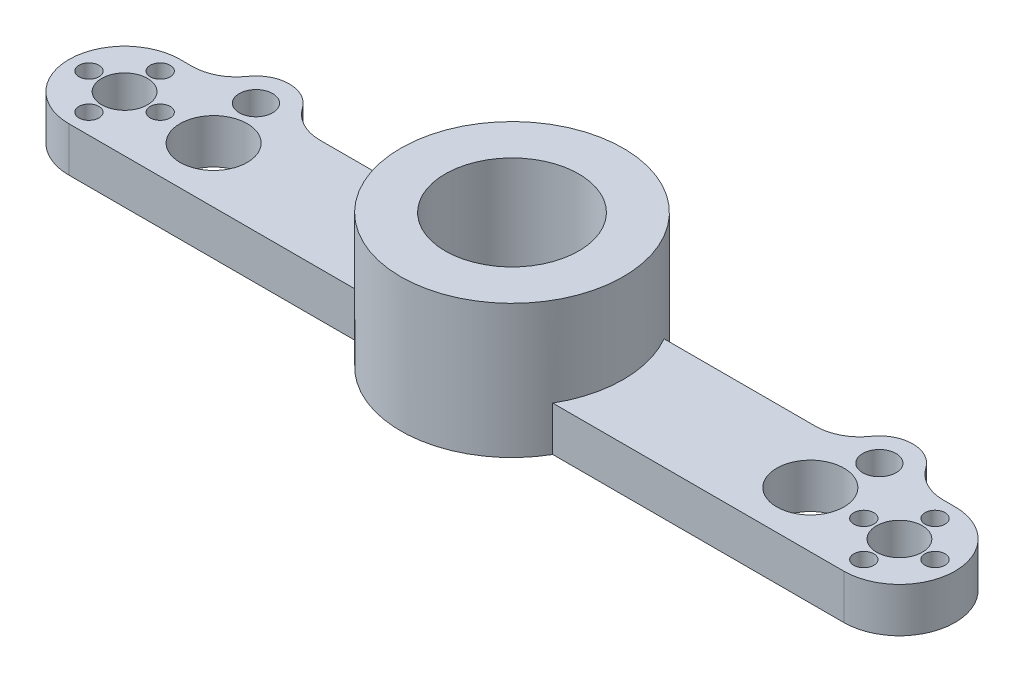
ISO-10303-21;
HEADER;
FILE_DESCRIPTION(('STEP AP214'),'2;1');
FILE_NAME('part.step','',(''),(''),'','','');
FILE_SCHEMA(('AUTOMOTIVE_DESIGN { 1 0 10303 214 1 1 1 1 }'));
ENDSEC;
DATA;
#1=APPLICATION_CONTEXT('core data for automotive mechanical design processes');
#2=APPLICATION_PROTOCOL_DEFINITION('international standard','automotive_design',2000,#1);
#3=PRODUCT_CONTEXT('',#1,'mechanical');
#4=PRODUCT('Part','Part','',(#3));
#5=PRODUCT_RELATED_PRODUCT_CATEGORY('part','',(#4));
#6=PRODUCT_DEFINITION_FORMATION('','',#4);
#7=PRODUCT_DEFINITION_CONTEXT('part definition',#1,'design');
#8=PRODUCT_DEFINITION('design','',#6,#7);
#9=PRODUCT_DEFINITION_SHAPE('','',#8);
#10=(LENGTH_UNIT() NAMED_UNIT(*) SI_UNIT(.MILLI.,.METRE.));
#11=(NAMED_UNIT(*) PLANE_ANGLE_UNIT() SI_UNIT($,.RADIAN.));
#12=(NAMED_UNIT(*) SI_UNIT($,.STERADIAN.) SOLID_ANGLE_UNIT());
#13=UNCERTAINTY_MEASURE_WITH_UNIT(LENGTH_MEASURE(1.E-05),#10,'distance_accuracy_value','');
#14=(GEOMETRIC_REPRESENTATION_CONTEXT(3) GLOBAL_UNCERTAINTY_ASSIGNED_CONTEXT((#13)) GLOBAL_UNIT_ASSIGNED_CONTEXT((#10,
#11,#12)) REPRESENTATION_CONTEXT('',''));
#15=CARTESIAN_POINT('',(0.,0.,0.));
#16=DIRECTION('',(0.,0.,1.));
#17=DIRECTION('',(1.,0.,0.));
#18=AXIS2_PLACEMENT_3D('',#15,#16,#17);
#19=CARTESIAN_POINT('',(-87.,10.,-12.5));
#20=DIRECTION('',(0.,0.,1.));
#21=DIRECTION('',(1.,0.,0.));
#22=AXIS2_PLACEMENT_3D('',#19,#20,#21);
#23=PLANE('',#22);
#24=DIRECTION('',(-1.,0.,0.));
#25=VECTOR('',#24,1.);
#26=CARTESIAN_POINT('',(-87.,0.,-12.5));
#27=LINE('',#26,#25);
#28=CARTESIAN_POINT('',(-21.650635094611,0.,-12.5));
#29=VERTEX_POINT('',#28);
#30=CARTESIAN_POINT('',(-55.6385933836576,0.,-12.5));
#31=VERTEX_POINT('',#30);
#32=EDGE_CURVE('E281',#29,#31,#27,.T.);
#33=ORIENTED_EDGE('',*,*,#32,.T.);
#34=DIRECTION('',(0.,1.,0.));
#35=VECTOR('',#34,1.);
#36=CARTESIAN_POINT('',(-55.6385933836576,10.,-12.5));
#37=LINE('',#36,#35);
#38=CARTESIAN_POINT('',(-55.6385933836576,10.,-12.5));
#39=VERTEX_POINT('',#38);
#40=EDGE_CURVE('E204',#31,#39,#37,.T.);
#41=ORIENTED_EDGE('',*,*,#40,.T.);
#42=DIRECTION('',(-1.,0.,0.));
#43=VECTOR('',#42,1.);
#44=CARTESIAN_POINT('',(-87.,10.,-12.5));
#45=LINE('',#44,#43);
#46=CARTESIAN_POINT('',(-21.650635094611,10.,-12.5));
#47=VERTEX_POINT('',#46);
#48=EDGE_CURVE('E259',#47,#39,#45,.T.);
#49=ORIENTED_EDGE('',*,*,#48,.F.);
#50=DIRECTION('',(0.,-1.,0.));
#51=VECTOR('',#50,1.);
#52=CARTESIAN_POINT('',(-21.650635094611,10.,-12.5));
#53=LINE('',#52,#51);
#54=EDGE_CURVE('E183',#47,#29,#53,.T.);
#55=ORIENTED_EDGE('',*,*,#54,.T.);
#56=EDGE_LOOP('',(#33,#41,#49,#55));
#57=FACE_BOUND('',#56,.T.);
#58=ADVANCED_FACE('F32',(#57),#23,.F.);
#59=CARTESIAN_POINT('',(21.650635094611,10.,-12.5));
#60=DIRECTION('',(0.,0.,1.));
#61=DIRECTION('',(1.,0.,0.));
#62=AXIS2_PLACEMENT_3D('',#59,#60,#61);
#63=PLANE('',#62);
#64=DIRECTION('',(-1.,0.,0.));
#65=VECTOR('',#64,1.);
#66=CARTESIAN_POINT('',(21.650635094611,0.,-12.5));
#67=LINE('',#66,#65);
#68=CARTESIAN_POINT('',(87.,0.,-12.5));
#69=VERTEX_POINT('',#68);
#70=CARTESIAN_POINT('',(84.3614066163478,0.,-12.5));
#71=VERTEX_POINT('',#70);
#72=EDGE_CURVE('E260',#69,#71,#67,.T.);
#73=ORIENTED_EDGE('',*,*,#72,.T.);
#74=DIRECTION('',(0.,1.,0.));
#75=VECTOR('',#74,1.);
#76=CARTESIAN_POINT('',(84.3614066163478,10.,-12.5));
#77=LINE('',#76,#75);
#78=CARTESIAN_POINT('',(84.3614066163478,10.,-12.5));
#79=VERTEX_POINT('',#78);
#80=EDGE_CURVE('E182',#71,#79,#77,.T.);
#81=ORIENTED_EDGE('',*,*,#80,.T.);
#82=DIRECTION('',(-1.,0.,0.));
#83=VECTOR('',#82,1.);
#84=CARTESIAN_POINT('',(21.650635094611,10.,-12.5));
#85=LINE('',#84,#83);
#86=CARTESIAN_POINT('',(87.,10.,-12.5));
#87=VERTEX_POINT('',#86);
#88=EDGE_CURVE('E274',#87,#79,#85,.T.);
#89=ORIENTED_EDGE('',*,*,#88,.F.);
#90=DIRECTION('',(0.,-1.,0.));
#91=VECTOR('',#90,1.);
#92=CARTESIAN_POINT('',(87.,10.,-12.5));
#93=LINE('',#92,#91);
#94=EDGE_CURVE('E293',#87,#69,#93,.T.);
#95=ORIENTED_EDGE('',*,*,#94,.T.);
#96=EDGE_LOOP('',(#73,#81,#89,#95));
#97=FACE_BOUND('',#96,.T.);
#98=ADVANCED_FACE('F313',(#97),#63,.F.);
#99=CARTESIAN_POINT('',(0.,10.,0.));
#100=DIRECTION('',(0.,1.,0.));
#101=DIRECTION('',(0.,0.,1.));
#102=AXIS2_PLACEMENT_3D('',#99,#100,#101);
#103=PLANE('',#102);
#104=CARTESIAN_POINT('',(70.0000000000027,10.,-12.5));
#105=DIRECTION('',(0.,1.,0.));
#106=DIRECTION('',(0.,0.,1.));
#107=AXIS2_PLACEMENT_3D('',#104,#105,#106);
#108=CIRCLE('',#107,3.75);
#109=CARTESIAN_POINT('',(70.0000000000027,10.,-8.75));
#110=VERTEX_POINT('',#109);
#111=EDGE_CURVE('E350',#110,#110,#108,.T.);
#112=ORIENTED_EDGE('',*,*,#111,.F.);
#113=EDGE_LOOP('',(#112));
#114=FACE_BOUND('',#113,.T.);
#115=CARTESIAN_POINT('',(0.,10.,0.));
#116=DIRECTION('',(0.,1.,0.));
#117=DIRECTION('',(0.,0.,1.));
#118=AXIS2_PLACEMENT_3D('',#115,#116,#117);
#119=CIRCLE('',#118,25.);
#120=CARTESIAN_POINT('',(21.650635094611,10.,12.5));
#121=VERTEX_POINT('',#120);
#122=CARTESIAN_POINT('',(21.650635094611,10.,-12.5));
#123=VERTEX_POINT('',#122);
#124=EDGE_CURVE('E160',#121,#123,#119,.T.);
#125=ORIENTED_EDGE('',*,*,#124,.F.);
#126=DIRECTION('',(1.,0.,0.));
#127=VECTOR('',#126,1.);
#128=CARTESIAN_POINT('',(87.,10.,12.5));
#129=LINE('',#128,#127);
#130=CARTESIAN_POINT('',(87.,10.,12.5));
#131=VERTEX_POINT('',#130);
#132=EDGE_CURVE('E143',#121,#131,#129,.T.);
#133=ORIENTED_EDGE('',*,*,#132,.T.);
#134=CARTESIAN_POINT('',(87.,10.,0.));
#135=DIRECTION('',(0.,1.,0.));
#136=DIRECTION('',(0.,0.,1.));
#137=AXIS2_PLACEMENT_3D('',#134,#135,#136);
#138=CIRCLE('',#137,12.5);
#139=EDGE_CURVE('E152',#131,#87,#138,.T.);
#140=ORIENTED_EDGE('',*,*,#139,.T.);
#141=ORIENTED_EDGE('',*,*,#88,.T.);
#142=CARTESIAN_POINT('',(84.3614066163478,10.,-22.5));
#143=DIRECTION('',(0.,1.,0.));
#144=DIRECTION('',(0.,0.,1.));
#145=AXIS2_PLACEMENT_3D('',#142,#143,#144);
#146=CIRCLE('',#145,10.);
#147=CARTESIAN_POINT('',(76.1548885498649,10.,-16.7857142857143));
#148=VERTEX_POINT('',#147);
#149=EDGE_CURVE('E215',#79,#148,#146,.F.);
#150=ORIENTED_EDGE('',*,*,#149,.T.);
#151=CARTESIAN_POINT('',(70.0000000000027,10.,-12.5));
#152=DIRECTION('',(0.,1.,0.));
#153=DIRECTION('',(0.,0.,1.));
#154=AXIS2_PLACEMENT_3D('',#151,#152,#153);
#155=CIRCLE('',#154,7.50000000000001);
#156=CARTESIAN_POINT('',(63.8451114501405,10.,-16.7857142857143));
#157=VERTEX_POINT('',#156);
#158=EDGE_CURVE('E246',#148,#157,#155,.T.);
#159=ORIENTED_EDGE('',*,*,#158,.T.);
#160=CARTESIAN_POINT('',(55.6385933836576,10.,-22.5));
#161=DIRECTION('',(0.,1.,0.));
#162=DIRECTION('',(0.,0.,1.));
#163=AXIS2_PLACEMENT_3D('',#160,#161,#162);
#164=CIRCLE('',#163,10.);
#165=CARTESIAN_POINT('',(55.6385933836576,10.,-12.5));
#166=VERTEX_POINT('',#165);
#167=EDGE_CURVE('E40',#157,#166,#164,.F.);
#168=ORIENTED_EDGE('',*,*,#167,.T.);
#169=EDGE_CURVE('E168',#166,#123,#85,.T.);
#170=ORIENTED_EDGE('',*,*,#169,.T.);
#171=EDGE_LOOP('',(#125,#133,#140,#141,#150,#159,#168,#170));
#172=FACE_BOUND('',#171,.T.);
#173=CARTESIAN_POINT('',(87.,10.,0.));
#174=DIRECTION('',(0.,1.,0.));
#175=DIRECTION('',(0.,0.,1.));
#176=AXIS2_PLACEMENT_3D('',#173,#174,#175);
#177=CIRCLE('',#176,5.15);
#178=CARTESIAN_POINT('',(87.,10.,5.15));
#179=VERTEX_POINT('',#178);
#180=EDGE_CURVE('E786',#179,#179,#177,.T.);
#181=ORIENTED_EDGE('',*,*,#180,.F.);
#182=EDGE_LOOP('',(#181));
#183=FACE_BOUND('',#182,.T.);
#184=CARTESIAN_POINT('',(87.,10.,-8.));
#185=DIRECTION('',(0.,1.,0.));
#186=DIRECTION('',(0.,0.,1.));
#187=AXIS2_PLACEMENT_3D('',#184,#185,#186);
#188=CIRCLE('',#187,2.25);
#189=CARTESIAN_POINT('',(87.,10.,-5.75));
#190=VERTEX_POINT('',#189);
#191=EDGE_CURVE('E809',#190,#190,#188,.T.);
#192=ORIENTED_EDGE('',*,*,#191,.F.);
#193=EDGE_LOOP('',(#192));
#194=FACE_BOUND('',#193,.T.);
#195=CARTESIAN_POINT('',(95.,10.,0.));
#196=DIRECTION('',(0.,1.,0.));
#197=DIRECTION('',(0.,0.,1.));
#198=AXIS2_PLACEMENT_3D('',#195,#196,#197);
#199=CIRCLE('',#198,2.25);
#200=CARTESIAN_POINT('',(95.,10.,2.25000000000003));
#201=VERTEX_POINT('',#200);
#202=EDGE_CURVE('E813',#201,#201,#199,.T.);
#203=ORIENTED_EDGE('',*,*,#202,.F.);
#204=EDGE_LOOP('',(#203));
#205=FACE_BOUND('',#204,.T.);
#206=CARTESIAN_POINT('',(87.,10.,8.));
#207=DIRECTION('',(0.,1.,0.));
#208=DIRECTION('',(0.,0.,1.));
#209=AXIS2_PLACEMENT_3D('',#206,#207,#208);
#210=CIRCLE('',#209,2.25);
#211=CARTESIAN_POINT('',(87.,10.,10.25));
#212=VERTEX_POINT('',#211);
#213=EDGE_CURVE('E817',#212,#212,#210,.T.);
#214=ORIENTED_EDGE('',*,*,#213,.F.);
#215=EDGE_LOOP('',(#214));
#216=FACE_BOUND('',#215,.T.);
#217=CARTESIAN_POINT('',(79.,10.,0.));
#218=DIRECTION('',(0.,1.,0.));
#219=DIRECTION('',(0.,0.,1.));
#220=AXIS2_PLACEMENT_3D('',#217,#218,#219);
#221=CIRCLE('',#220,2.25);
#222=CARTESIAN_POINT('',(79.,10.,2.24999999999992));
#223=VERTEX_POINT('',#222);
#224=EDGE_CURVE('E821',#223,#223,#221,.T.);
#225=ORIENTED_EDGE('',*,*,#224,.F.);
#226=EDGE_LOOP('',(#225));
#227=FACE_BOUND('',#226,.T.);
#228=CARTESIAN_POINT('',(67.,10.,0.));
#229=DIRECTION('',(0.,-1.,0.));
#230=DIRECTION('',(0.,0.,1.));
#231=AXIS2_PLACEMENT_3D('',#228,#229,#230);
#232=CIRCLE('',#231,7.55);
#233=CARTESIAN_POINT('',(67.,10.,7.55));
#234=VERTEX_POINT('',#233);
#235=EDGE_CURVE('E175',#234,#234,#232,.T.);
#236=ORIENTED_EDGE('',*,*,#235,.T.);
#237=EDGE_LOOP('',(#236));
#238=FACE_BOUND('',#237,.T.);
#239=ADVANCED_FACE('F166',(#114,#172,#183,#194,#205,#216,#227,#238),#103,.T.);
#240=CARTESIAN_POINT('',(-70.0000000000027,10.,-12.5));
#241=DIRECTION('',(0.,1.,0.));
#242=DIRECTION('',(0.,0.,1.));
#243=AXIS2_PLACEMENT_3D('',#240,#241,#242);
#244=CIRCLE('',#243,3.75);
#245=CARTESIAN_POINT('',(-70.0000000000027,10.,-8.74999999999999));
#246=VERTEX_POINT('',#245);
#247=EDGE_CURVE('E338',#246,#246,#244,.T.);
#248=ORIENTED_EDGE('',*,*,#247,.F.);
#249=EDGE_LOOP('',(#248));
#250=FACE_BOUND('',#249,.T.);
#251=CARTESIAN_POINT('',(-21.650635094611,10.,12.5));
#252=VERTEX_POINT('',#251);
#253=EDGE_CURVE('E173',#47,#252,#119,.T.);
#254=ORIENTED_EDGE('',*,*,#253,.F.);
#255=ORIENTED_EDGE('',*,*,#48,.T.);
#256=CARTESIAN_POINT('',(-55.6385933836576,10.,-22.5));
#257=DIRECTION('',(0.,1.,0.));
#258=DIRECTION('',(0.,0.,1.));
#259=AXIS2_PLACEMENT_3D('',#256,#257,#258);
#260=CIRCLE('',#259,10.);
#261=CARTESIAN_POINT('',(-63.8451114501405,10.,-16.7857142857143));
#262=VERTEX_POINT('',#261);
#263=EDGE_CURVE('E219',#39,#262,#260,.F.);
#264=ORIENTED_EDGE('',*,*,#263,.T.);
#265=CARTESIAN_POINT('',(-70.0000000000027,10.,-12.5));
#266=DIRECTION('',(0.,1.,0.));
#267=DIRECTION('',(0.,0.,-1.));
#268=AXIS2_PLACEMENT_3D('',#265,#266,#267);
#269=CIRCLE('',#268,7.50000000000001);
#270=CARTESIAN_POINT('',(-76.1548885498649,10.,-16.7857142857143));
#271=VERTEX_POINT('',#270);
#272=EDGE_CURVE('E247',#262,#271,#269,.T.);
#273=ORIENTED_EDGE('',*,*,#272,.T.);
#274=CARTESIAN_POINT('',(-84.3614066163478,10.,-22.5));
#275=DIRECTION('',(0.,1.,0.));
#276=DIRECTION('',(0.,0.,1.));
#277=AXIS2_PLACEMENT_3D('',#274,#275,#276);
#278=CIRCLE('',#277,10.);
#279=CARTESIAN_POINT('',(-84.3614066163478,10.,-12.5));
#280=VERTEX_POINT('',#279);
#281=EDGE_CURVE('E223',#271,#280,#278,.F.);
#282=ORIENTED_EDGE('',*,*,#281,.T.);
#283=CARTESIAN_POINT('',(-87.,10.,-12.5));
#284=VERTEX_POINT('',#283);
#285=EDGE_CURVE('E254',#280,#284,#45,.T.);
#286=ORIENTED_EDGE('',*,*,#285,.T.);
#287=CARTESIAN_POINT('',(-87.,10.,0.));
#288=DIRECTION('',(0.,1.,0.));
#289=DIRECTION('',(0.,0.,1.));
#290=AXIS2_PLACEMENT_3D('',#287,#288,#289);
#291=CIRCLE('',#290,12.5);
#292=CARTESIAN_POINT('',(-87.,10.,12.5));
#293=VERTEX_POINT('',#292);
#294=EDGE_CURVE('E263',#284,#293,#291,.T.);
#295=ORIENTED_EDGE('',*,*,#294,.T.);
#296=DIRECTION('',(1.,0.,0.));
#297=VECTOR('',#296,1.);
#298=CARTESIAN_POINT('',(-21.650635094611,10.,12.5));
#299=LINE('',#298,#297);
#300=EDGE_CURVE('E153',#293,#252,#299,.T.);
#301=ORIENTED_EDGE('',*,*,#300,.T.);
#302=EDGE_LOOP('',(#254,#255,#264,#273,#282,#286,#295,#301));
#303=FACE_BOUND('',#302,.T.);
#304=CARTESIAN_POINT('',(-67.,10.,0.));
#305=DIRECTION('',(0.,1.,0.));
#306=DIRECTION('',(0.,0.,1.));
#307=AXIS2_PLACEMENT_3D('',#304,#305,#306);
#308=CIRCLE('',#307,7.55);
#309=CARTESIAN_POINT('',(-67.,10.,7.55));
#310=VERTEX_POINT('',#309);
#311=EDGE_CURVE('E835',#310,#310,#308,.T.);
#312=ORIENTED_EDGE('',*,*,#311,.F.);
#313=EDGE_LOOP('',(#312));
#314=FACE_BOUND('',#313,.T.);
#315=CARTESIAN_POINT('',(-79.,10.,0.));
#316=DIRECTION('',(0.,1.,0.));
#317=DIRECTION('',(0.,0.,1.));
#318=AXIS2_PLACEMENT_3D('',#315,#316,#317);
#319=CIRCLE('',#318,2.25);
#320=CARTESIAN_POINT('',(-79.,10.,2.24999999999992));
#321=VERTEX_POINT('',#320);
#322=EDGE_CURVE('E837',#321,#321,#319,.T.);
#323=ORIENTED_EDGE('',*,*,#322,.F.);
#324=EDGE_LOOP('',(#323));
#325=FACE_BOUND('',#324,.T.);
#326=CARTESIAN_POINT('',(-87.,10.,8.));
#327=DIRECTION('',(0.,1.,0.));
#328=DIRECTION('',(0.,0.,1.));
#329=AXIS2_PLACEMENT_3D('',#326,#327,#328);
#330=CIRCLE('',#329,2.25);
#331=CARTESIAN_POINT('',(-87.,10.,10.25));
#332=VERTEX_POINT('',#331);
#333=EDGE_CURVE('E843',#332,#332,#330,.T.);
#334=ORIENTED_EDGE('',*,*,#333,.F.);
#335=EDGE_LOOP('',(#334));
#336=FACE_BOUND('',#335,.T.);
#337=CARTESIAN_POINT('',(-95.,10.,0.));
#338=DIRECTION('',(0.,1.,0.));
#339=DIRECTION('',(0.,0.,1.));
#340=AXIS2_PLACEMENT_3D('',#337,#338,#339);
#341=CIRCLE('',#340,2.25);
#342=CARTESIAN_POINT('',(-95.,10.,2.25000000000003));
#343=VERTEX_POINT('',#342);
#344=EDGE_CURVE('E847',#343,#343,#341,.T.);
#345=ORIENTED_EDGE('',*,*,#344,.F.);
#346=EDGE_LOOP('',(#345));
#347=FACE_BOUND('',#346,.T.);
#348=CARTESIAN_POINT('',(-87.,10.,-8.));
#349=DIRECTION('',(0.,1.,0.));
#350=DIRECTION('',(0.,0.,1.));
#351=AXIS2_PLACEMENT_3D('',#348,#349,#350);
#352=CIRCLE('',#351,2.25);
#353=CARTESIAN_POINT('',(-87.,10.,-5.75));
#354=VERTEX_POINT('',#353);
#355=EDGE_CURVE('E777',#354,#354,#352,.T.);
#356=ORIENTED_EDGE('',*,*,#355,.F.);
#357=EDGE_LOOP('',(#356));
#358=FACE_BOUND('',#357,.T.);
#359=CARTESIAN_POINT('',(-87.,10.,0.));
#360=DIRECTION('',(0.,1.,0.));
#361=DIRECTION('',(0.,0.,1.));
#362=AXIS2_PLACEMENT_3D('',#359,#360,#361);
#363=CIRCLE('',#362,5.15);
#364=CARTESIAN_POINT('',(-87.,10.,5.15));
#365=VERTEX_POINT('',#364);
#366=EDGE_CURVE('E280',#365,#365,#363,.T.);
#367=ORIENTED_EDGE('',*,*,#366,.F.);
#368=EDGE_LOOP('',(#367));
#369=FACE_BOUND('',#368,.T.);
#370=ADVANCED_FACE('F252',(#250,#303,#314,#325,#336,#347,#358,#369),#103,.T.);
#371=CARTESIAN_POINT('',(0.,0.,0.));
#372=DIRECTION('',(0.,1.,0.));
#373=DIRECTION('',(0.,0.,1.));
#374=AXIS2_PLACEMENT_3D('',#371,#372,#373);
#375=PLANE('',#374);
#376=CARTESIAN_POINT('',(70.0000000000027,0.,-12.5));
#377=DIRECTION('',(0.,1.,0.));
#378=DIRECTION('',(0.,0.,1.));
#379=AXIS2_PLACEMENT_3D('',#376,#377,#378);
#380=CIRCLE('',#379,1.69999999999999);
#381=CARTESIAN_POINT('',(70.0000000000027,0.,-10.8));
#382=VERTEX_POINT('',#381);
#383=EDGE_CURVE('E341',#382,#382,#380,.T.);
#384=ORIENTED_EDGE('',*,*,#383,.T.);
#385=EDGE_LOOP('',(#384));
#386=FACE_BOUND('',#385,.T.);
#387=CARTESIAN_POINT('',(-70.0000000000027,0.,-12.5));
#388=DIRECTION('',(0.,1.,0.));
#389=DIRECTION('',(0.,0.,1.));
#390=AXIS2_PLACEMENT_3D('',#387,#388,#389);
#391=CIRCLE('',#390,1.69999999999999);
#392=CARTESIAN_POINT('',(-70.0000000000027,0.,-10.8));
#393=VERTEX_POINT('',#392);
#394=EDGE_CURVE('E328',#393,#393,#391,.T.);
#395=ORIENTED_EDGE('',*,*,#394,.T.);
#396=EDGE_LOOP('',(#395));
#397=FACE_BOUND('',#396,.T.);
#398=CARTESIAN_POINT('',(67.,0.,0.));
#399=DIRECTION('',(0.,-1.,0.));
#400=DIRECTION('',(0.,0.,1.));
#401=AXIS2_PLACEMENT_3D('',#398,#399,#400);
#402=CIRCLE('',#401,7.55);
#403=CARTESIAN_POINT('',(67.,0.,7.55));
#404=VERTEX_POINT('',#403);
#405=EDGE_CURVE('E740',#404,#404,#402,.T.);
#406=ORIENTED_EDGE('',*,*,#405,.F.);
#407=EDGE_LOOP('',(#406));
#408=FACE_BOUND('',#407,.T.);
#409=CARTESIAN_POINT('',(79.,0.,0.));
#410=DIRECTION('',(0.,1.,0.));
#411=DIRECTION('',(0.,0.,1.));
#412=AXIS2_PLACEMENT_3D('',#409,#410,#411);
#413=CIRCLE('',#412,2.25);
#414=CARTESIAN_POINT('',(79.,0.,2.24999999999992));
#415=VERTEX_POINT('',#414);
#416=EDGE_CURVE('E744',#415,#415,#413,.T.);
#417=ORIENTED_EDGE('',*,*,#416,.T.);
#418=EDGE_LOOP('',(#417));
#419=FACE_BOUND('',#418,.T.);
#420=CARTESIAN_POINT('',(87.,0.,8.));
#421=DIRECTION('',(0.,1.,0.));
#422=DIRECTION('',(0.,0.,1.));
#423=AXIS2_PLACEMENT_3D('',#420,#421,#422);
#424=CIRCLE('',#423,2.25);
#425=CARTESIAN_POINT('',(87.,0.,10.25));
#426=VERTEX_POINT('',#425);
#427=EDGE_CURVE('E748',#426,#426,#424,.T.);
#428=ORIENTED_EDGE('',*,*,#427,.T.);
#429=EDGE_LOOP('',(#428));
#430=FACE_BOUND('',#429,.T.);
#431=CARTESIAN_POINT('',(95.,0.,0.));
#432=DIRECTION('',(0.,1.,0.));
#433=DIRECTION('',(0.,0.,1.));
#434=AXIS2_PLACEMENT_3D('',#431,#432,#433);
#435=CIRCLE('',#434,2.25);
#436=CARTESIAN_POINT('',(95.,0.,2.25000000000003));
#437=VERTEX_POINT('',#436);
#438=EDGE_CURVE('E752',#437,#437,#435,.T.);
#439=ORIENTED_EDGE('',*,*,#438,.T.);
#440=EDGE_LOOP('',(#439));
#441=FACE_BOUND('',#440,.T.);
#442=CARTESIAN_POINT('',(87.,0.,-8.));
#443=DIRECTION('',(0.,1.,0.));
#444=DIRECTION('',(0.,0.,1.));
#445=AXIS2_PLACEMENT_3D('',#442,#443,#444);
#446=CIRCLE('',#445,2.25);
#447=CARTESIAN_POINT('',(87.,0.,-5.75));
#448=VERTEX_POINT('',#447);
#449=EDGE_CURVE('E756',#448,#448,#446,.T.);
#450=ORIENTED_EDGE('',*,*,#449,.T.);
#451=EDGE_LOOP('',(#450));
#452=FACE_BOUND('',#451,.T.);
#453=CARTESIAN_POINT('',(-67.,0.,0.));
#454=DIRECTION('',(0.,1.,0.));
#455=DIRECTION('',(0.,0.,1.));
#456=AXIS2_PLACEMENT_3D('',#453,#454,#455);
#457=CIRCLE('',#456,7.55);
#458=CARTESIAN_POINT('',(-67.,0.,7.55));
#459=VERTEX_POINT('',#458);
#460=EDGE_CURVE('E760',#459,#459,#457,.T.);
#461=ORIENTED_EDGE('',*,*,#460,.T.);
#462=EDGE_LOOP('',(#461));
#463=FACE_BOUND('',#462,.T.);
#464=CARTESIAN_POINT('',(-79.,0.,0.));
#465=DIRECTION('',(0.,1.,0.));
#466=DIRECTION('',(0.,0.,1.));
#467=AXIS2_PLACEMENT_3D('',#464,#465,#466);
#468=CIRCLE('',#467,2.25);
#469=CARTESIAN_POINT('',(-79.,0.,2.24999999999992));
#470=VERTEX_POINT('',#469);
#471=EDGE_CURVE('E764',#470,#470,#468,.T.);
#472=ORIENTED_EDGE('',*,*,#471,.T.);
#473=EDGE_LOOP('',(#472));
#474=FACE_BOUND('',#473,.T.);
#475=CARTESIAN_POINT('',(-87.,0.,8.));
#476=DIRECTION('',(0.,1.,0.));
#477=DIRECTION('',(0.,0.,1.));
#478=AXIS2_PLACEMENT_3D('',#475,#476,#477);
#479=CIRCLE('',#478,2.25);
#480=CARTESIAN_POINT('',(-87.,0.,10.25));
#481=VERTEX_POINT('',#480);
#482=EDGE_CURVE('E768',#481,#481,#479,.T.);
#483=ORIENTED_EDGE('',*,*,#482,.T.);
#484=EDGE_LOOP('',(#483));
#485=FACE_BOUND('',#484,.T.);
#486=CARTESIAN_POINT('',(-95.,0.,0.));
#487=DIRECTION('',(0.,1.,0.));
#488=DIRECTION('',(0.,0.,1.));
#489=AXIS2_PLACEMENT_3D('',#486,#487,#488);
#490=CIRCLE('',#489,2.25);
#491=CARTESIAN_POINT('',(-95.,0.,2.25000000000003));
#492=VERTEX_POINT('',#491);
#493=EDGE_CURVE('E772',#492,#492,#490,.T.);
#494=ORIENTED_EDGE('',*,*,#493,.T.);
#495=EDGE_LOOP('',(#494));
#496=FACE_BOUND('',#495,.T.);
#497=CARTESIAN_POINT('',(-87.,0.,-8.));
#498=DIRECTION('',(0.,1.,0.));
#499=DIRECTION('',(0.,0.,1.));
#500=AXIS2_PLACEMENT_3D('',#497,#498,#499);
#501=CIRCLE('',#500,2.25);
#502=CARTESIAN_POINT('',(-87.,0.,-5.75));
#503=VERTEX_POINT('',#502);
#504=EDGE_CURVE('E775',#503,#503,#501,.T.);
#505=ORIENTED_EDGE('',*,*,#504,.T.);
#506=EDGE_LOOP('',(#505));
#507=FACE_BOUND('',#506,.T.);
#508=CARTESIAN_POINT('',(0.,0.,0.));
#509=DIRECTION('',(0.,1.,0.));
#510=DIRECTION('',(0.,0.,1.));
#511=AXIS2_PLACEMENT_3D('',#508,#509,#510);
#512=CIRCLE('',#511,25.);
#513=CARTESIAN_POINT('',(21.650635094611,0.,-12.5));
#514=VERTEX_POINT('',#513);
#515=EDGE_CURVE('E278',#514,#29,#512,.T.);
#516=ORIENTED_EDGE('',*,*,#515,.F.);
#517=CARTESIAN_POINT('',(55.6385933836576,0.,-12.5));
#518=VERTEX_POINT('',#517);
#519=EDGE_CURVE('E265',#518,#514,#67,.T.);
#520=ORIENTED_EDGE('',*,*,#519,.F.);
#521=CARTESIAN_POINT('',(55.6385933836576,0.,-22.5));
#522=DIRECTION('',(0.,1.,0.));
#523=DIRECTION('',(0.,0.,1.));
#524=AXIS2_PLACEMENT_3D('',#521,#522,#523);
#525=CIRCLE('',#524,10.);
#526=CARTESIAN_POINT('',(63.8451114501405,0.,-16.7857142857143));
#527=VERTEX_POINT('',#526);
#528=EDGE_CURVE('E11',#518,#527,#525,.T.);
#529=ORIENTED_EDGE('',*,*,#528,.T.);
#530=CARTESIAN_POINT('',(70.0000000000027,0.,-12.5));
#531=DIRECTION('',(0.,1.,0.));
#532=DIRECTION('',(0.,0.,1.));
#533=AXIS2_PLACEMENT_3D('',#530,#531,#532);
#534=CIRCLE('',#533,7.50000000000001);
#535=CARTESIAN_POINT('',(76.1548885498649,0.,-16.7857142857143));
#536=VERTEX_POINT('',#535);
#537=EDGE_CURVE('E178',#536,#527,#534,.T.);
#538=ORIENTED_EDGE('',*,*,#537,.F.);
#539=CARTESIAN_POINT('',(84.3614066163478,0.,-22.5));
#540=DIRECTION('',(0.,1.,0.));
#541=DIRECTION('',(0.,0.,1.));
#542=AXIS2_PLACEMENT_3D('',#539,#540,#541);
#543=CIRCLE('',#542,10.);
#544=EDGE_CURVE('E217',#536,#71,#543,.T.);
#545=ORIENTED_EDGE('',*,*,#544,.T.);
#546=ORIENTED_EDGE('',*,*,#72,.F.);
#547=CARTESIAN_POINT('',(87.,0.,0.));
#548=DIRECTION('',(0.,1.,0.));
#549=DIRECTION('',(0.,0.,1.));
#550=AXIS2_PLACEMENT_3D('',#547,#548,#549);
#551=CIRCLE('',#550,12.5);
#552=CARTESIAN_POINT('',(87.,0.,12.5));
#553=VERTEX_POINT('',#552);
#554=EDGE_CURVE('E290',#553,#69,#551,.T.);
#555=ORIENTED_EDGE('',*,*,#554,.F.);
#556=DIRECTION('',(1.,0.,0.));
#557=VECTOR('',#556,1.);
#558=CARTESIAN_POINT('',(87.,0.,12.5));
#559=LINE('',#558,#557);
#560=CARTESIAN_POINT('',(21.650635094611,0.,12.5));
#561=VERTEX_POINT('',#560);
#562=EDGE_CURVE('E288',#561,#553,#559,.T.);
#563=ORIENTED_EDGE('',*,*,#562,.F.);
#564=CARTESIAN_POINT('',(0.,0.,0.));
#565=DIRECTION('',(0.,1.,0.));
#566=DIRECTION('',(0.,0.,1.));
#567=AXIS2_PLACEMENT_3D('',#564,#565,#566);
#568=CIRCLE('',#567,25.);
#569=CARTESIAN_POINT('',(-21.650635094611,0.,12.5));
#570=VERTEX_POINT('',#569);
#571=EDGE_CURVE('E163',#570,#561,#568,.T.);
#572=ORIENTED_EDGE('',*,*,#571,.F.);
#573=DIRECTION('',(1.,0.,0.));
#574=VECTOR('',#573,1.);
#575=CARTESIAN_POINT('',(-21.650635094611,0.,12.5));
#576=LINE('',#575,#574);
#577=CARTESIAN_POINT('',(-87.,0.,12.5));
#578=VERTEX_POINT('',#577);
#579=EDGE_CURVE('E285',#578,#570,#576,.T.);
#580=ORIENTED_EDGE('',*,*,#579,.F.);
#581=CARTESIAN_POINT('',(-87.,0.,0.));
#582=DIRECTION('',(0.,1.,0.));
#583=DIRECTION('',(0.,0.,1.));
#584=AXIS2_PLACEMENT_3D('',#581,#582,#583);
#585=CIRCLE('',#584,12.5);
#586=CARTESIAN_POINT('',(-87.,0.,-12.5));
#587=VERTEX_POINT('',#586);
#588=EDGE_CURVE('E283',#587,#578,#585,.T.);
#589=ORIENTED_EDGE('',*,*,#588,.F.);
#590=CARTESIAN_POINT('',(-84.3614066163478,0.,-12.5));
#591=VERTEX_POINT('',#590);
#592=EDGE_CURVE('E237',#591,#587,#27,.T.);
#593=ORIENTED_EDGE('',*,*,#592,.F.);
#594=CARTESIAN_POINT('',(-84.3614066163478,0.,-22.5));
#595=DIRECTION('',(0.,1.,0.));
#596=DIRECTION('',(0.,0.,1.));
#597=AXIS2_PLACEMENT_3D('',#594,#595,#596);
#598=CIRCLE('',#597,10.);
#599=CARTESIAN_POINT('',(-76.1548885498649,0.,-16.7857142857143));
#600=VERTEX_POINT('',#599);
#601=EDGE_CURVE('E225',#591,#600,#598,.T.);
#602=ORIENTED_EDGE('',*,*,#601,.T.);
#603=CARTESIAN_POINT('',(-70.0000000000027,0.,-12.5));
#604=DIRECTION('',(0.,1.,0.));
#605=DIRECTION('',(0.,0.,-1.));
#606=AXIS2_PLACEMENT_3D('',#603,#604,#605);
#607=CIRCLE('',#606,7.50000000000001);
#608=CARTESIAN_POINT('',(-63.8451114501405,0.,-16.7857142857143));
#609=VERTEX_POINT('',#608);
#610=EDGE_CURVE('E234',#609,#600,#607,.T.);
#611=ORIENTED_EDGE('',*,*,#610,.F.);
#612=CARTESIAN_POINT('',(-55.6385933836576,0.,-22.5));
#613=DIRECTION('',(0.,1.,0.));
#614=DIRECTION('',(0.,0.,1.));
#615=AXIS2_PLACEMENT_3D('',#612,#613,#614);
#616=CIRCLE('',#615,10.);
#617=EDGE_CURVE('E221',#609,#31,#616,.T.);
#618=ORIENTED_EDGE('',*,*,#617,.T.);
#619=ORIENTED_EDGE('',*,*,#32,.F.);
#620=EDGE_LOOP('',(#516,#520,#529,#538,#545,#546,#555,#563,#572,#580,#589,#593,#602,#611,#618,#619));
#621=FACE_BOUND('',#620,.T.);
#622=CARTESIAN_POINT('',(-87.,0.,0.));
#623=DIRECTION('',(0.,1.,0.));
#624=DIRECTION('',(0.,0.,1.));
#625=AXIS2_PLACEMENT_3D('',#622,#623,#624);
#626=CIRCLE('',#625,5.15);
#627=CARTESIAN_POINT('',(-87.,0.,5.15));
#628=VERTEX_POINT('',#627);
#629=EDGE_CURVE('E269',#628,#628,#626,.T.);
#630=ORIENTED_EDGE('',*,*,#629,.T.);
#631=EDGE_LOOP('',(#630));
#632=FACE_BOUND('',#631,.T.);
#633=CARTESIAN_POINT('',(87.,0.,0.));
#634=DIRECTION('',(0.,1.,0.));
#635=DIRECTION('',(0.,0.,1.));
#636=AXIS2_PLACEMENT_3D('',#633,#634,#635);
#637=CIRCLE('',#636,5.15);
#638=CARTESIAN_POINT('',(87.,0.,5.15));
#639=VERTEX_POINT('',#638);
#640=EDGE_CURVE('E780',#639,#639,#637,.T.);
#641=ORIENTED_EDGE('',*,*,#640,.T.);
#642=EDGE_LOOP('',(#641));
#643=FACE_BOUND('',#642,.T.);
#644=CARTESIAN_POINT('',(0.,0.,0.));
#645=DIRECTION('',(0.,1.,0.));
#646=DIRECTION('',(0.,0.,1.));
#647=AXIS2_PLACEMENT_3D('',#644,#645,#646);
#648=CIRCLE('',#647,15.);
#649=CARTESIAN_POINT('',(0.,0.,15.));
#650=VERTEX_POINT('',#649);
#651=EDGE_CURVE('E776',#650,#650,#648,.T.);
#652=ORIENTED_EDGE('',*,*,#651,.T.);
#653=EDGE_LOOP('',(#652));
#654=FACE_BOUND('',#653,.T.);
#655=ADVANCED_FACE('F232',(#386,#397,#408,#419,#430,#441,#452,#463,#474,#485,#496,#507,#621,
#632,#643,#654),#375,.F.);
#656=ORIENTED_EDGE('',*,*,#285,.F.);
#657=DIRECTION('',(0.,1.,0.));
#658=VECTOR('',#657,1.);
#659=CARTESIAN_POINT('',(-84.3614066163478,10.,-12.5));
#660=LINE('',#659,#658);
#661=EDGE_CURVE('E212',#280,#591,#660,.F.);
#662=ORIENTED_EDGE('',*,*,#661,.T.);
#663=ORIENTED_EDGE('',*,*,#592,.T.);
#664=DIRECTION('',(0.,-1.,0.));
#665=VECTOR('',#664,1.);
#666=CARTESIAN_POINT('',(-87.,10.,-12.5));
#667=LINE('',#666,#665);
#668=EDGE_CURVE('E189',#284,#587,#667,.T.);
#669=ORIENTED_EDGE('',*,*,#668,.F.);
#670=EDGE_LOOP('',(#656,#662,#663,#669));
#671=FACE_BOUND('',#670,.T.);
#672=ADVANCED_FACE('F257',(#671),#23,.F.);
#673=CARTESIAN_POINT('',(-87.,10.,0.));
#674=DIRECTION('',(0.,-1.,0.));
#675=DIRECTION('',(0.,0.,-1.));
#676=AXIS2_PLACEMENT_3D('',#673,#674,#675);
#677=CYLINDRICAL_SURFACE('',#676,12.5);
#678=ORIENTED_EDGE('',*,*,#588,.T.);
#679=DIRECTION('',(0.,-1.,0.));
#680=VECTOR('',#679,1.);
#681=CARTESIAN_POINT('',(-87.,10.,12.5));
#682=LINE('',#681,#680);
#683=EDGE_CURVE('E196',#293,#578,#682,.T.);
#684=ORIENTED_EDGE('',*,*,#683,.F.);
#685=ORIENTED_EDGE('',*,*,#294,.F.);
#686=ORIENTED_EDGE('',*,*,#668,.T.);
#687=EDGE_LOOP('',(#678,#684,#685,#686));
#688=FACE_BOUND('',#687,.T.);
#689=ADVANCED_FACE('F374',(#688),#677,.T.);
#690=CARTESIAN_POINT('',(-21.650635094611,10.,12.5));
#691=DIRECTION('',(0.,0.,-1.));
#692=DIRECTION('',(-1.,0.,0.));
#693=AXIS2_PLACEMENT_3D('',#690,#691,#692);
#694=PLANE('',#693);
#695=ORIENTED_EDGE('',*,*,#579,.T.);
#696=DIRECTION('',(0.,-1.,0.));
#697=VECTOR('',#696,1.);
#698=CARTESIAN_POINT('',(-21.650635094611,10.,12.5));
#699=LINE('',#698,#697);
#700=EDGE_CURVE('E164',#252,#570,#699,.T.);
#701=ORIENTED_EDGE('',*,*,#700,.F.);
#702=ORIENTED_EDGE('',*,*,#300,.F.);
#703=ORIENTED_EDGE('',*,*,#683,.T.);
#704=EDGE_LOOP('',(#695,#701,#702,#703));
#705=FACE_BOUND('',#704,.T.);
#706=ADVANCED_FACE('F302',(#705),#694,.F.);
#707=CARTESIAN_POINT('',(0.,10.,0.));
#708=DIRECTION('',(0.,-1.,0.));
#709=DIRECTION('',(0.,0.,-1.));
#710=AXIS2_PLACEMENT_3D('',#707,#708,#709);
#711=CYLINDRICAL_SURFACE('',#710,25.);
#712=ORIENTED_EDGE('',*,*,#571,.T.);
#713=DIRECTION('',(0.,-1.,0.));
#714=VECTOR('',#713,1.);
#715=CARTESIAN_POINT('',(21.650635094611,10.,12.5));
#716=LINE('',#715,#714);
#717=EDGE_CURVE('E146',#121,#561,#716,.T.);
#718=ORIENTED_EDGE('',*,*,#717,.F.);
#719=ORIENTED_EDGE('',*,*,#124,.T.);
#720=DIRECTION('',(0.,-1.,0.));
#721=VECTOR('',#720,1.);
#722=CARTESIAN_POINT('',(21.650635094611,10.,-12.5));
#723=LINE('',#722,#721);
#724=EDGE_CURVE('E277',#123,#514,#723,.T.);
#725=ORIENTED_EDGE('',*,*,#724,.T.);
#726=ORIENTED_EDGE('',*,*,#515,.T.);
#727=ORIENTED_EDGE('',*,*,#54,.F.);
#728=ORIENTED_EDGE('',*,*,#253,.T.);
#729=ORIENTED_EDGE('',*,*,#700,.T.);
#730=EDGE_LOOP('',(#712,#718,#719,#725,#726,#727,#728,#729));
#731=FACE_BOUND('',#730,.T.);
#732=CARTESIAN_POINT('',(0.,30.,0.));
#733=DIRECTION('',(0.,1.,0.));
#734=DIRECTION('',(0.,0.,1.));
#735=AXIS2_PLACEMENT_3D('',#732,#733,#734);
#736=CIRCLE('',#735,25.);
#737=CARTESIAN_POINT('',(0.,30.,25.));
#738=VERTEX_POINT('',#737);
#739=EDGE_CURVE('E170',#738,#738,#736,.T.);
#740=ORIENTED_EDGE('',*,*,#739,.F.);
#741=EDGE_LOOP('',(#740));
#742=FACE_BOUND('',#741,.T.);
#743=ADVANCED_FACE('F157',(#731,#742),#711,.T.);
#744=CARTESIAN_POINT('',(87.,10.,12.5));
#745=DIRECTION('',(0.,0.,-1.));
#746=DIRECTION('',(-1.,0.,0.));
#747=AXIS2_PLACEMENT_3D('',#744,#745,#746);
#748=PLANE('',#747);
#749=ORIENTED_EDGE('',*,*,#562,.T.);
#750=DIRECTION('',(0.,-1.,0.));
#751=VECTOR('',#750,1.);
#752=CARTESIAN_POINT('',(87.,10.,12.5));
#753=LINE('',#752,#751);
#754=EDGE_CURVE('E149',#131,#553,#753,.T.);
#755=ORIENTED_EDGE('',*,*,#754,.F.);
#756=ORIENTED_EDGE('',*,*,#132,.F.);
#757=ORIENTED_EDGE('',*,*,#717,.T.);
#758=EDGE_LOOP('',(#749,#755,#756,#757));
#759=FACE_BOUND('',#758,.T.);
#760=ADVANCED_FACE('F145',(#759),#748,.F.);
#761=CARTESIAN_POINT('',(87.,10.,0.));
#762=DIRECTION('',(0.,-1.,0.));
#763=DIRECTION('',(0.,0.,-1.));
#764=AXIS2_PLACEMENT_3D('',#761,#762,#763);
#765=CYLINDRICAL_SURFACE('',#764,12.5);
#766=ORIENTED_EDGE('',*,*,#554,.T.);
#767=ORIENTED_EDGE('',*,*,#94,.F.);
#768=ORIENTED_EDGE('',*,*,#139,.F.);
#769=ORIENTED_EDGE('',*,*,#754,.T.);
#770=EDGE_LOOP('',(#766,#767,#768,#769));
#771=FACE_BOUND('',#770,.T.);
#772=ADVANCED_FACE('F308',(#771),#765,.T.);
#773=ORIENTED_EDGE('',*,*,#169,.F.);
#774=DIRECTION('',(0.,1.,0.));
#775=VECTOR('',#774,1.);
#776=CARTESIAN_POINT('',(55.6385933836576,10.,-12.5));
#777=LINE('',#776,#775);
#778=EDGE_CURVE('E47',#166,#518,#777,.F.);
#779=ORIENTED_EDGE('',*,*,#778,.T.);
#780=ORIENTED_EDGE('',*,*,#519,.T.);
#781=ORIENTED_EDGE('',*,*,#724,.F.);
#782=EDGE_LOOP('',(#773,#779,#780,#781));
#783=FACE_BOUND('',#782,.T.);
#784=ADVANCED_FACE('F364',(#783),#63,.F.);
#785=CARTESIAN_POINT('',(-87.,10.,0.));
#786=DIRECTION('',(0.,-1.,0.));
#787=DIRECTION('',(0.,0.,-1.));
#788=AXIS2_PLACEMENT_3D('',#785,#786,#787);
#789=CYLINDRICAL_SURFACE('',#788,5.15);
#790=ORIENTED_EDGE('',*,*,#366,.T.);
#791=EDGE_LOOP('',(#790));
#792=FACE_BOUND('',#791,.T.);
#793=ORIENTED_EDGE('',*,*,#629,.F.);
#794=EDGE_LOOP('',(#793));
#795=FACE_BOUND('',#794,.T.);
#796=ADVANCED_FACE('F385',(#792,#795),#789,.F.);
#797=CARTESIAN_POINT('',(87.,10.,0.));
#798=DIRECTION('',(0.,-1.,0.));
#799=DIRECTION('',(0.,0.,-1.));
#800=AXIS2_PLACEMENT_3D('',#797,#798,#799);
#801=CYLINDRICAL_SURFACE('',#800,5.15);
#802=ORIENTED_EDGE('',*,*,#180,.T.);
#803=EDGE_LOOP('',(#802));
#804=FACE_BOUND('',#803,.T.);
#805=ORIENTED_EDGE('',*,*,#640,.F.);
#806=EDGE_LOOP('',(#805));
#807=FACE_BOUND('',#806,.T.);
#808=ADVANCED_FACE('F422',(#804,#807),#801,.F.);
#809=CARTESIAN_POINT('',(0.,10.,0.));
#810=DIRECTION('',(0.,-1.,0.));
#811=DIRECTION('',(0.,0.,-1.));
#812=AXIS2_PLACEMENT_3D('',#809,#810,#811);
#813=CYLINDRICAL_SURFACE('',#812,15.);
#814=ORIENTED_EDGE('',*,*,#651,.F.);
#815=EDGE_LOOP('',(#814));
#816=FACE_BOUND('',#815,.T.);
#817=CARTESIAN_POINT('',(0.,30.,0.));
#818=DIRECTION('',(0.,1.,0.));
#819=DIRECTION('',(0.,0.,1.));
#820=AXIS2_PLACEMENT_3D('',#817,#818,#819);
#821=CIRCLE('',#820,15.);
#822=CARTESIAN_POINT('',(0.,30.,15.));
#823=VERTEX_POINT('',#822);
#824=EDGE_CURVE('E171',#823,#823,#821,.T.);
#825=ORIENTED_EDGE('',*,*,#824,.T.);
#826=EDGE_LOOP('',(#825));
#827=FACE_BOUND('',#826,.T.);
#828=ADVANCED_FACE('F429',(#816,#827),#813,.F.);
#829=CARTESIAN_POINT('',(-87.,10.,-8.));
#830=DIRECTION('',(0.,1.,0.));
#831=DIRECTION('',(0.,0.,1.));
#832=AXIS2_PLACEMENT_3D('',#829,#830,#831);
#833=CYLINDRICAL_SURFACE('',#832,2.25);
#834=ORIENTED_EDGE('',*,*,#504,.F.);
#835=EDGE_LOOP('',(#834));
#836=FACE_BOUND('',#835,.T.);
#837=ORIENTED_EDGE('',*,*,#355,.T.);
#838=EDGE_LOOP('',(#837));
#839=FACE_BOUND('',#838,.T.);
#840=ADVANCED_FACE('F437',(#836,#839),#833,.F.);
#841=CARTESIAN_POINT('',(-95.,10.,0.));
#842=DIRECTION('',(0.,1.,0.));
#843=DIRECTION('',(0.,0.,1.));
#844=AXIS2_PLACEMENT_3D('',#841,#842,#843);
#845=CYLINDRICAL_SURFACE('',#844,2.25);
#846=ORIENTED_EDGE('',*,*,#493,.F.);
#847=EDGE_LOOP('',(#846));
#848=FACE_BOUND('',#847,.T.);
#849=ORIENTED_EDGE('',*,*,#344,.T.);
#850=EDGE_LOOP('',(#849));
#851=FACE_BOUND('',#850,.T.);
#852=ADVANCED_FACE('F445',(#848,#851),#845,.F.);
#853=CARTESIAN_POINT('',(-87.,10.,8.));
#854=DIRECTION('',(0.,1.,0.));
#855=DIRECTION('',(0.,0.,1.));
#856=AXIS2_PLACEMENT_3D('',#853,#854,#855);
#857=CYLINDRICAL_SURFACE('',#856,2.25);
#858=ORIENTED_EDGE('',*,*,#482,.F.);
#859=EDGE_LOOP('',(#858));
#860=FACE_BOUND('',#859,.T.);
#861=ORIENTED_EDGE('',*,*,#333,.T.);
#862=EDGE_LOOP('',(#861));
#863=FACE_BOUND('',#862,.T.);
#864=ADVANCED_FACE('F453',(#860,#863),#857,.F.);
#865=CARTESIAN_POINT('',(-79.,10.,0.));
#866=DIRECTION('',(0.,1.,0.));
#867=DIRECTION('',(0.,0.,1.));
#868=AXIS2_PLACEMENT_3D('',#865,#866,#867);
#869=CYLINDRICAL_SURFACE('',#868,2.25);
#870=ORIENTED_EDGE('',*,*,#471,.F.);
#871=EDGE_LOOP('',(#870));
#872=FACE_BOUND('',#871,.T.);
#873=ORIENTED_EDGE('',*,*,#322,.T.);
#874=EDGE_LOOP('',(#873));
#875=FACE_BOUND('',#874,.T.);
#876=ADVANCED_FACE('F461',(#872,#875),#869,.F.);
#877=CARTESIAN_POINT('',(-67.,0.,0.));
#878=DIRECTION('',(0.,1.,0.));
#879=DIRECTION('',(0.,0.,1.));
#880=AXIS2_PLACEMENT_3D('',#877,#878,#879);
#881=CYLINDRICAL_SURFACE('',#880,7.55);
#882=ORIENTED_EDGE('',*,*,#460,.F.);
#883=EDGE_LOOP('',(#882));
#884=FACE_BOUND('',#883,.T.);
#885=ORIENTED_EDGE('',*,*,#311,.T.);
#886=EDGE_LOOP('',(#885));
#887=FACE_BOUND('',#886,.T.);
#888=ADVANCED_FACE('F469',(#884,#887),#881,.F.);
#889=CARTESIAN_POINT('',(87.,10.,-8.));
#890=DIRECTION('',(0.,1.,0.));
#891=DIRECTION('',(0.,0.,1.));
#892=AXIS2_PLACEMENT_3D('',#889,#890,#891);
#893=CYLINDRICAL_SURFACE('',#892,2.25);
#894=ORIENTED_EDGE('',*,*,#449,.F.);
#895=EDGE_LOOP('',(#894));
#896=FACE_BOUND('',#895,.T.);
#897=ORIENTED_EDGE('',*,*,#191,.T.);
#898=EDGE_LOOP('',(#897));
#899=FACE_BOUND('',#898,.T.);
#900=ADVANCED_FACE('F477',(#896,#899),#893,.F.);
#901=CARTESIAN_POINT('',(95.,10.,0.));
#902=DIRECTION('',(0.,1.,0.));
#903=DIRECTION('',(0.,0.,1.));
#904=AXIS2_PLACEMENT_3D('',#901,#902,#903);
#905=CYLINDRICAL_SURFACE('',#904,2.25);
#906=ORIENTED_EDGE('',*,*,#438,.F.);
#907=EDGE_LOOP('',(#906));
#908=FACE_BOUND('',#907,.T.);
#909=ORIENTED_EDGE('',*,*,#202,.T.);
#910=EDGE_LOOP('',(#909));
#911=FACE_BOUND('',#910,.T.);
#912=ADVANCED_FACE('F485',(#908,#911),#905,.F.);
#913=CARTESIAN_POINT('',(87.,10.,8.));
#914=DIRECTION('',(0.,1.,0.));
#915=DIRECTION('',(0.,0.,1.));
#916=AXIS2_PLACEMENT_3D('',#913,#914,#915);
#917=CYLINDRICAL_SURFACE('',#916,2.25);
#918=ORIENTED_EDGE('',*,*,#427,.F.);
#919=EDGE_LOOP('',(#918));
#920=FACE_BOUND('',#919,.T.);
#921=ORIENTED_EDGE('',*,*,#213,.T.);
#922=EDGE_LOOP('',(#921));
#923=FACE_BOUND('',#922,.T.);
#924=ADVANCED_FACE('F493',(#920,#923),#917,.F.);
#925=CARTESIAN_POINT('',(79.,10.,0.));
#926=DIRECTION('',(0.,1.,0.));
#927=DIRECTION('',(0.,0.,1.));
#928=AXIS2_PLACEMENT_3D('',#925,#926,#927);
#929=CYLINDRICAL_SURFACE('',#928,2.25);
#930=ORIENTED_EDGE('',*,*,#416,.F.);
#931=EDGE_LOOP('',(#930));
#932=FACE_BOUND('',#931,.T.);
#933=ORIENTED_EDGE('',*,*,#224,.T.);
#934=EDGE_LOOP('',(#933));
#935=FACE_BOUND('',#934,.T.);
#936=ADVANCED_FACE('F501',(#932,#935),#929,.F.);
#937=CARTESIAN_POINT('',(67.,0.,0.));
#938=DIRECTION('',(0.,1.,0.));
#939=DIRECTION('',(0.,0.,1.));
#940=AXIS2_PLACEMENT_3D('',#937,#938,#939);
#941=CYLINDRICAL_SURFACE('',#940,7.55);
#942=ORIENTED_EDGE('',*,*,#405,.T.);
#943=EDGE_LOOP('',(#942));
#944=FACE_BOUND('',#943,.T.);
#945=ORIENTED_EDGE('',*,*,#235,.F.);
#946=EDGE_LOOP('',(#945));
#947=FACE_BOUND('',#946,.T.);
#948=ADVANCED_FACE('F509',(#944,#947),#941,.F.);
#949=CARTESIAN_POINT('',(0.,30.,0.));
#950=DIRECTION('',(0.,1.,0.));
#951=DIRECTION('',(0.,0.,1.));
#952=AXIS2_PLACEMENT_3D('',#949,#950,#951);
#953=PLANE('',#952);
#954=ORIENTED_EDGE('',*,*,#739,.T.);
#955=EDGE_LOOP('',(#954));
#956=FACE_BOUND('',#955,.T.);
#957=ORIENTED_EDGE('',*,*,#824,.F.);
#958=EDGE_LOOP('',(#957));
#959=FACE_BOUND('',#958,.T.);
#960=ADVANCED_FACE('F516',(#956,#959),#953,.T.);
#961=CARTESIAN_POINT('',(70.0000000000027,0.,-12.5));
#962=DIRECTION('',(0.,1.,0.));
#963=DIRECTION('',(0.,0.,1.));
#964=AXIS2_PLACEMENT_3D('',#961,#962,#963);
#965=CYLINDRICAL_SURFACE('',#964,7.50000000000001);
#966=ORIENTED_EDGE('',*,*,#158,.F.);
#967=DIRECTION('',(0.,1.,0.));
#968=VECTOR('',#967,1.);
#969=CARTESIAN_POINT('',(76.1548885498649,0.,-16.7857142857143));
#970=LINE('',#969,#968);
#971=EDGE_CURVE('E202',#148,#536,#970,.F.);
#972=ORIENTED_EDGE('',*,*,#971,.T.);
#973=ORIENTED_EDGE('',*,*,#537,.T.);
#974=DIRECTION('',(0.,1.,0.));
#975=VECTOR('',#974,1.);
#976=CARTESIAN_POINT('',(63.8451114501405,0.,-16.7857142857143));
#977=LINE('',#976,#975);
#978=EDGE_CURVE('E186',#527,#157,#977,.T.);
#979=ORIENTED_EDGE('',*,*,#978,.T.);
#980=EDGE_LOOP('',(#966,#972,#973,#979));
#981=FACE_BOUND('',#980,.T.);
#982=ADVANCED_FACE('F322',(#981),#965,.T.);
#983=CARTESIAN_POINT('',(-70.0000000000027,0.,-12.5));
#984=DIRECTION('',(0.,1.,0.));
#985=DIRECTION('',(0.,0.,1.));
#986=AXIS2_PLACEMENT_3D('',#983,#984,#985);
#987=CYLINDRICAL_SURFACE('',#986,7.50000000000001);
#988=ORIENTED_EDGE('',*,*,#272,.F.);
#989=DIRECTION('',(0.,1.,0.));
#990=VECTOR('',#989,1.);
#991=CARTESIAN_POINT('',(-63.8451114501405,0.,-16.7857142857143));
#992=LINE('',#991,#990);
#993=EDGE_CURVE('E210',#262,#609,#992,.F.);
#994=ORIENTED_EDGE('',*,*,#993,.T.);
#995=ORIENTED_EDGE('',*,*,#610,.T.);
#996=DIRECTION('',(0.,1.,0.));
#997=VECTOR('',#996,1.);
#998=CARTESIAN_POINT('',(-76.1548885498649,0.,-16.7857142857143));
#999=LINE('',#998,#997);
#1000=EDGE_CURVE('E207',#600,#271,#999,.T.);
#1001=ORIENTED_EDGE('',*,*,#1000,.T.);
#1002=EDGE_LOOP('',(#988,#994,#995,#1001));
#1003=FACE_BOUND('',#1002,.T.);
#1004=ADVANCED_FACE('F243',(#1003),#987,.T.);
#1005=CARTESIAN_POINT('',(-70.0000000000027,10.,-12.5));
#1006=DIRECTION('',(0.,1.,0.));
#1007=DIRECTION('',(0.,0.,1.));
#1008=AXIS2_PLACEMENT_3D('',#1005,#1006,#1007);
#1009=CYLINDRICAL_SURFACE('',#1008,1.69999999999999);
#1010=ORIENTED_EDGE('',*,*,#394,.F.);
#1011=EDGE_LOOP('',(#1010));
#1012=FACE_BOUND('',#1011,.T.);
#1013=CARTESIAN_POINT('',(-70.0000000000027,3.6,-12.5));
#1014=DIRECTION('',(0.,1.,0.));
#1015=DIRECTION('',(0.,0.,1.));
#1016=AXIS2_PLACEMENT_3D('',#1013,#1014,#1015);
#1017=CIRCLE('',#1016,1.69999999999999);
#1018=CARTESIAN_POINT('',(-70.0000000000027,3.6,-10.8));
#1019=VERTEX_POINT('',#1018);
#1020=EDGE_CURVE('E332',#1019,#1019,#1017,.T.);
#1021=ORIENTED_EDGE('',*,*,#1020,.T.);
#1022=EDGE_LOOP('',(#1021));
#1023=FACE_BOUND('',#1022,.T.);
#1024=ADVANCED_FACE('F536',(#1012,#1023),#1009,.F.);
#1025=CARTESIAN_POINT('',(-68.3000000000027,3.6,-12.5));
#1026=DIRECTION('',(0.,-1.,0.));
#1027=DIRECTION('',(0.,0.,-1.));
#1028=AXIS2_PLACEMENT_3D('',#1025,#1026,#1027);
#1029=PLANE('',#1028);
#1030=ORIENTED_EDGE('',*,*,#1020,.F.);
#1031=EDGE_LOOP('',(#1030));
#1032=FACE_BOUND('',#1031,.T.);
#1033=CARTESIAN_POINT('',(-70.0000000000027,3.6,-12.5));
#1034=DIRECTION('',(0.,1.,0.));
#1035=DIRECTION('',(0.,0.,1.));
#1036=AXIS2_PLACEMENT_3D('',#1033,#1034,#1035);
#1037=CIRCLE('',#1036,3.75);
#1038=CARTESIAN_POINT('',(-70.0000000000027,3.6,-8.74999999999999));
#1039=VERTEX_POINT('',#1038);
#1040=EDGE_CURVE('E335',#1039,#1039,#1037,.T.);
#1041=ORIENTED_EDGE('',*,*,#1040,.T.);
#1042=EDGE_LOOP('',(#1041));
#1043=FACE_BOUND('',#1042,.T.);
#1044=ADVANCED_FACE('F543',(#1032,#1043),#1029,.F.);
#1045=CARTESIAN_POINT('',(-70.0000000000027,10.,-12.5));
#1046=DIRECTION('',(0.,1.,0.));
#1047=DIRECTION('',(0.,0.,1.));
#1048=AXIS2_PLACEMENT_3D('',#1045,#1046,#1047);
#1049=CYLINDRICAL_SURFACE('',#1048,3.75);
#1050=ORIENTED_EDGE('',*,*,#1040,.F.);
#1051=EDGE_LOOP('',(#1050));
#1052=FACE_BOUND('',#1051,.T.);
#1053=ORIENTED_EDGE('',*,*,#247,.T.);
#1054=EDGE_LOOP('',(#1053));
#1055=FACE_BOUND('',#1054,.T.);
#1056=ADVANCED_FACE('F551',(#1052,#1055),#1049,.F.);
#1057=CARTESIAN_POINT('',(70.0000000000027,10.,-12.5));
#1058=DIRECTION('',(0.,1.,0.));
#1059=DIRECTION('',(0.,0.,1.));
#1060=AXIS2_PLACEMENT_3D('',#1057,#1058,#1059);
#1061=CYLINDRICAL_SURFACE('',#1060,1.69999999999999);
#1062=ORIENTED_EDGE('',*,*,#383,.F.);
#1063=EDGE_LOOP('',(#1062));
#1064=FACE_BOUND('',#1063,.T.);
#1065=CARTESIAN_POINT('',(70.0000000000027,3.6,-12.5));
#1066=DIRECTION('',(0.,1.,0.));
#1067=DIRECTION('',(0.,0.,1.));
#1068=AXIS2_PLACEMENT_3D('',#1065,#1066,#1067);
#1069=CIRCLE('',#1068,1.69999999999999);
#1070=CARTESIAN_POINT('',(70.0000000000027,3.6,-10.8));
#1071=VERTEX_POINT('',#1070);
#1072=EDGE_CURVE('E344',#1071,#1071,#1069,.T.);
#1073=ORIENTED_EDGE('',*,*,#1072,.T.);
#1074=EDGE_LOOP('',(#1073));
#1075=FACE_BOUND('',#1074,.T.);
#1076=ADVANCED_FACE('F559',(#1064,#1075),#1061,.F.);
#1077=CARTESIAN_POINT('',(71.7000000000027,3.6,-12.5));
#1078=DIRECTION('',(0.,-1.,0.));
#1079=DIRECTION('',(0.,0.,-1.));
#1080=AXIS2_PLACEMENT_3D('',#1077,#1078,#1079);
#1081=PLANE('',#1080);
#1082=ORIENTED_EDGE('',*,*,#1072,.F.);
#1083=EDGE_LOOP('',(#1082));
#1084=FACE_BOUND('',#1083,.T.);
#1085=CARTESIAN_POINT('',(70.0000000000027,3.6,-12.5));
#1086=DIRECTION('',(0.,1.,0.));
#1087=DIRECTION('',(0.,0.,1.));
#1088=AXIS2_PLACEMENT_3D('',#1085,#1086,#1087);
#1089=CIRCLE('',#1088,3.75);
#1090=CARTESIAN_POINT('',(70.0000000000027,3.6,-8.75));
#1091=VERTEX_POINT('',#1090);
#1092=EDGE_CURVE('E347',#1091,#1091,#1089,.T.);
#1093=ORIENTED_EDGE('',*,*,#1092,.T.);
#1094=EDGE_LOOP('',(#1093));
#1095=FACE_BOUND('',#1094,.T.);
#1096=ADVANCED_FACE('F567',(#1084,#1095),#1081,.F.);
#1097=CARTESIAN_POINT('',(70.0000000000027,10.,-12.5));
#1098=DIRECTION('',(0.,1.,0.));
#1099=DIRECTION('',(0.,0.,1.));
#1100=AXIS2_PLACEMENT_3D('',#1097,#1098,#1099);
#1101=CYLINDRICAL_SURFACE('',#1100,3.75);
#1102=ORIENTED_EDGE('',*,*,#1092,.F.);
#1103=EDGE_LOOP('',(#1102));
#1104=FACE_BOUND('',#1103,.T.);
#1105=ORIENTED_EDGE('',*,*,#111,.T.);
#1106=EDGE_LOOP('',(#1105));
#1107=FACE_BOUND('',#1106,.T.);
#1108=ADVANCED_FACE('F354',(#1104,#1107),#1101,.F.);
#1109=CARTESIAN_POINT('',(84.3614066163478,0.,-22.5));
#1110=DIRECTION('',(0.,1.,0.));
#1111=DIRECTION('',(0.,0.,1.));
#1112=AXIS2_PLACEMENT_3D('',#1109,#1110,#1111);
#1113=CYLINDRICAL_SURFACE('',#1112,10.);
#1114=ORIENTED_EDGE('',*,*,#544,.F.);
#1115=ORIENTED_EDGE('',*,*,#971,.F.);
#1116=ORIENTED_EDGE('',*,*,#149,.F.);
#1117=ORIENTED_EDGE('',*,*,#80,.F.);
#1118=EDGE_LOOP('',(#1114,#1115,#1116,#1117));
#1119=FACE_BOUND('',#1118,.T.);
#1120=ADVANCED_FACE('F317',(#1119),#1113,.F.);
#1121=CARTESIAN_POINT('',(-55.6385933836576,0.,-22.5));
#1122=DIRECTION('',(0.,1.,0.));
#1123=DIRECTION('',(0.,0.,1.));
#1124=AXIS2_PLACEMENT_3D('',#1121,#1122,#1123);
#1125=CYLINDRICAL_SURFACE('',#1124,10.);
#1126=ORIENTED_EDGE('',*,*,#617,.F.);
#1127=ORIENTED_EDGE('',*,*,#993,.F.);
#1128=ORIENTED_EDGE('',*,*,#263,.F.);
#1129=ORIENTED_EDGE('',*,*,#40,.F.);
#1130=EDGE_LOOP('',(#1126,#1127,#1128,#1129));
#1131=FACE_BOUND('',#1130,.T.);
#1132=ADVANCED_FACE('F588',(#1131),#1125,.F.);
#1133=CARTESIAN_POINT('',(-84.3614066163478,0.,-22.5));
#1134=DIRECTION('',(0.,1.,0.));
#1135=DIRECTION('',(0.,0.,1.));
#1136=AXIS2_PLACEMENT_3D('',#1133,#1134,#1135);
#1137=CYLINDRICAL_SURFACE('',#1136,10.);
#1138=ORIENTED_EDGE('',*,*,#601,.F.);
#1139=ORIENTED_EDGE('',*,*,#661,.F.);
#1140=ORIENTED_EDGE('',*,*,#281,.F.);
#1141=ORIENTED_EDGE('',*,*,#1000,.F.);
#1142=EDGE_LOOP('',(#1138,#1139,#1140,#1141));
#1143=FACE_BOUND('',#1142,.T.);
#1144=ADVANCED_FACE('F249',(#1143),#1137,.F.);
#1145=CARTESIAN_POINT('',(55.6385933836576,0.,-22.5));
#1146=DIRECTION('',(0.,1.,0.));
#1147=DIRECTION('',(0.,0.,1.));
#1148=AXIS2_PLACEMENT_3D('',#1145,#1146,#1147);
#1149=CYLINDRICAL_SURFACE('',#1148,10.);
#1150=ORIENTED_EDGE('',*,*,#528,.F.);
#1151=ORIENTED_EDGE('',*,*,#778,.F.);
#1152=ORIENTED_EDGE('',*,*,#167,.F.);
#1153=ORIENTED_EDGE('',*,*,#978,.F.);
#1154=EDGE_LOOP('',(#1150,#1151,#1152,#1153));
#1155=FACE_BOUND('',#1154,.T.);
#1156=ADVANCED_FACE('F34',(#1155),#1149,.F.);
#1157=CLOSED_SHELL('',(#58,#98,#239,#370,#655,#672,#689,#706,#743,#760,#772,#784,#796,#808,#828,
#840,#852,#864,#876,#888,#900,#912,#924,#936,#948,#960,#982,#1004,#1024,#1044,#1056,#1076,#1096,
#1108,#1120,#1132,#1144,#1156));
#1158=MANIFOLD_SOLID_BREP('B2',#1157);
#1159=ADVANCED_BREP_SHAPE_REPRESENTATION('',(#18,#1158),#14);
#1160=SHAPE_DEFINITION_REPRESENTATION(#9,#1159);
ENDSEC;
END-ISO-10303-21;
